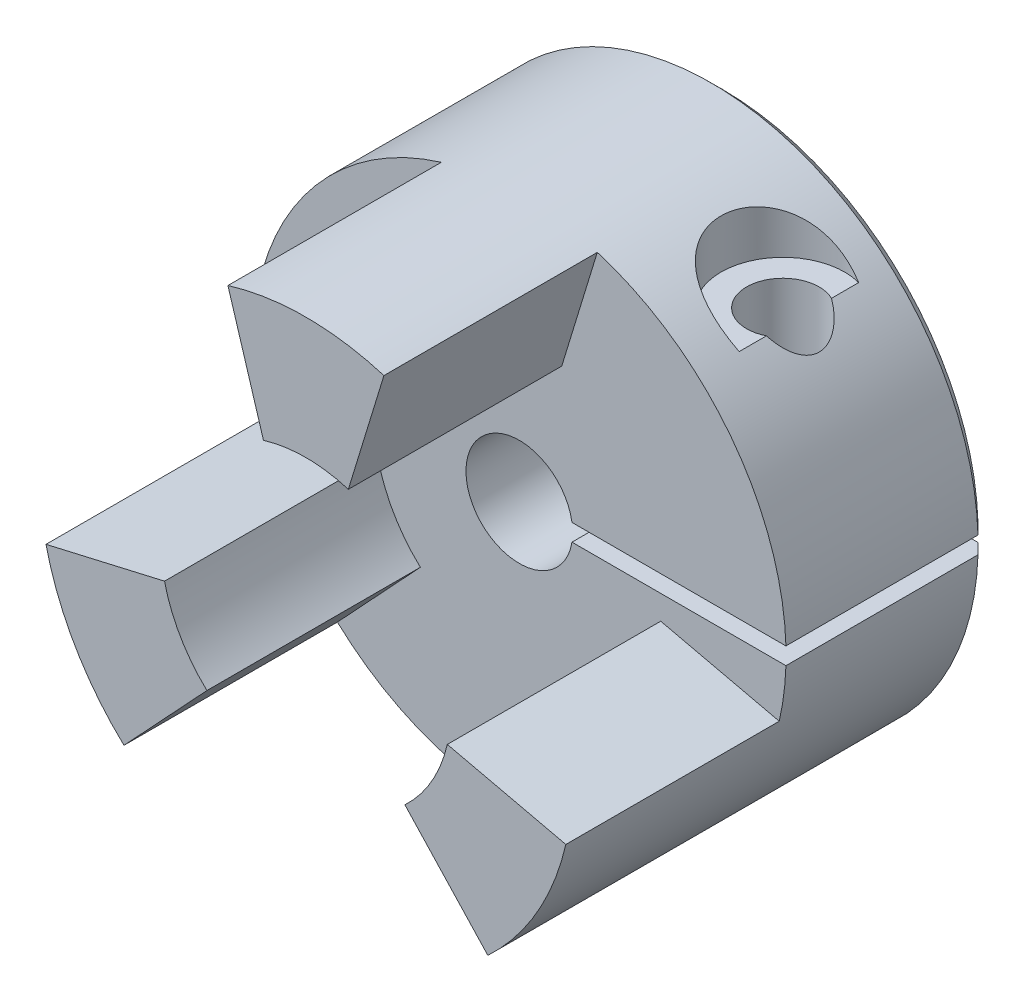
ISO-10303-21;
HEADER;
FILE_DESCRIPTION(('STEP AP214'),'2;1');
FILE_NAME('part.step','',(''),(''),'','','');
FILE_SCHEMA(('AUTOMOTIVE_DESIGN { 1 0 10303 214 1 1 1 1 }'));
ENDSEC;
DATA;
#1=APPLICATION_CONTEXT('core data for automotive mechanical design processes');
#2=APPLICATION_PROTOCOL_DEFINITION('international standard','automotive_design',2000,#1);
#3=PRODUCT_CONTEXT('',#1,'mechanical');
#4=PRODUCT('Part','Part','',(#3));
#5=PRODUCT_RELATED_PRODUCT_CATEGORY('part','',(#4));
#6=PRODUCT_DEFINITION_FORMATION('','',#4);
#7=PRODUCT_DEFINITION_CONTEXT('part definition',#1,'design');
#8=PRODUCT_DEFINITION('design','',#6,#7);
#9=PRODUCT_DEFINITION_SHAPE('','',#8);
#10=(LENGTH_UNIT() NAMED_UNIT(*) SI_UNIT(.MILLI.,.METRE.));
#11=(NAMED_UNIT(*) PLANE_ANGLE_UNIT() SI_UNIT($,.RADIAN.));
#12=(NAMED_UNIT(*) SI_UNIT($,.STERADIAN.) SOLID_ANGLE_UNIT());
#13=UNCERTAINTY_MEASURE_WITH_UNIT(LENGTH_MEASURE(1.E-05),#10,'distance_accuracy_value','');
#14=(GEOMETRIC_REPRESENTATION_CONTEXT(3) GLOBAL_UNCERTAINTY_ASSIGNED_CONTEXT((#13)) GLOBAL_UNIT_ASSIGNED_CONTEXT((#10,
#11,#12)) REPRESENTATION_CONTEXT('',''));
#15=CARTESIAN_POINT('',(0.,0.,0.));
#16=DIRECTION('',(0.,0.,1.));
#17=DIRECTION('',(1.,0.,0.));
#18=AXIS2_PLACEMENT_3D('',#15,#16,#17);
#19=CARTESIAN_POINT('',(-8.458759816138,-4.883667256857,19.5));
#20=DIRECTION('',(0.,0.,1.));
#21=DIRECTION('',(1.,0.,0.));
#22=AXIS2_PLACEMENT_3D('',#19,#20,#21);
#23=PLANE('',#22);
#24=DIRECTION('',(-0.974370064785194,-0.224951054344045,0.));
#25=VECTOR('',#24,1.);
#26=CARTESIAN_POINT('',(-6.62571644054,-1.529667169538,19.5));
#27=LINE('',#26,#25);
#28=CARTESIAN_POINT('',(-6.62571644054,-1.529667169538,19.5));
#29=VERTEX_POINT('',#28);
#30=CARTESIAN_POINT('',(-12.17962580981,-2.811888179298,19.5));
#31=VERTEX_POINT('',#30);
#32=EDGE_CURVE('E10',#29,#31,#27,.T.);
#33=ORIENTED_EDGE('',*,*,#32,.T.);
#34=CARTESIAN_POINT('',(0.,0.,19.5));
#35=DIRECTION('',(0.,0.,1.));
#36=DIRECTION('',(-0.974370064785194,-0.224951054344045,0.));
#37=AXIS2_PLACEMENT_3D('',#34,#35,#36);
#38=CIRCLE('',#37,12.5);
#39=CARTESIAN_POINT('',(-8.524979500781,-9.14192127024,19.5));
#40=VERTEX_POINT('',#39);
#41=EDGE_CURVE('E233',#31,#40,#38,.T.);
#42=ORIENTED_EDGE('',*,*,#41,.T.);
#43=DIRECTION('',(0.681998360062317,0.73135370161934,0.));
#44=VECTOR('',#43,1.);
#45=CARTESIAN_POINT('',(-8.524979500781,-9.14192127024,19.5));
#46=LINE('',#45,#44);
#47=CARTESIAN_POINT('',(-4.637588848425,-4.97320517101,19.5));
#48=VERTEX_POINT('',#47);
#49=EDGE_CURVE('E360',#40,#48,#46,.T.);
#50=ORIENTED_EDGE('',*,*,#49,.T.);
#51=CARTESIAN_POINT('',(0.,0.,19.5));
#52=DIRECTION('',(0.,0.,-1.));
#53=DIRECTION('',(-0.681998360062317,-0.73135370161934,0.));
#54=AXIS2_PLACEMENT_3D('',#51,#52,#53);
#55=CIRCLE('',#54,6.8);
#56=EDGE_CURVE('E30',#48,#29,#55,.T.);
#57=ORIENTED_EDGE('',*,*,#56,.T.);
#58=EDGE_LOOP('',(#33,#42,#50,#57));
#59=FACE_BOUND('',#58,.T.);
#60=ADVANCED_FACE('F16',(#59),#23,.T.);
#61=CARTESIAN_POINT('',(8.458759816138,-4.883667256857,19.5));
#62=DIRECTION('',(0.,0.,1.));
#63=DIRECTION('',(1.,0.,0.));
#64=AXIS2_PLACEMENT_3D('',#61,#62,#63);
#65=PLANE('',#64);
#66=DIRECTION('',(0.681998360062317,-0.73135370161934,0.));
#67=VECTOR('',#66,1.);
#68=CARTESIAN_POINT('',(4.637588848425,-4.97320517101,19.5));
#69=LINE('',#68,#67);
#70=CARTESIAN_POINT('',(4.637588848425,-4.97320517101,19.5));
#71=VERTEX_POINT('',#70);
#72=CARTESIAN_POINT('',(8.524979500781,-9.14192127024,19.5));
#73=VERTEX_POINT('',#72);
#74=EDGE_CURVE('E376',#71,#73,#69,.T.);
#75=ORIENTED_EDGE('',*,*,#74,.T.);
#76=CARTESIAN_POINT('',(0.,0.,19.5));
#77=DIRECTION('',(0.,0.,1.));
#78=DIRECTION('',(0.681998360062317,-0.73135370161934,0.));
#79=AXIS2_PLACEMENT_3D('',#76,#77,#78);
#80=CIRCLE('',#79,12.5);
#81=CARTESIAN_POINT('',(12.179625809815,-2.811888179298,19.5));
#82=VERTEX_POINT('',#81);
#83=EDGE_CURVE('E370',#73,#82,#80,.T.);
#84=ORIENTED_EDGE('',*,*,#83,.T.);
#85=DIRECTION('',(-0.974370064785194,0.224951054344045,0.));
#86=VECTOR('',#85,1.);
#87=CARTESIAN_POINT('',(12.179625809815,-2.811888179298,19.5));
#88=LINE('',#87,#86);
#89=CARTESIAN_POINT('',(6.62571644054,-1.529667169538,19.5));
#90=VERTEX_POINT('',#89);
#91=EDGE_CURVE('E335',#82,#90,#88,.T.);
#92=ORIENTED_EDGE('',*,*,#91,.T.);
#93=CARTESIAN_POINT('',(0.,0.,19.5));
#94=DIRECTION('',(0.,0.,-1.));
#95=DIRECTION('',(0.974370064785194,-0.224951054344045,0.));
#96=AXIS2_PLACEMENT_3D('',#93,#94,#95);
#97=CIRCLE('',#96,6.8);
#98=EDGE_CURVE('E374',#90,#71,#97,.T.);
#99=ORIENTED_EDGE('',*,*,#98,.T.);
#100=EDGE_LOOP('',(#75,#84,#92,#99));
#101=FACE_BOUND('',#100,.T.);
#102=ADVANCED_FACE('F666',(#101),#65,.T.);
#103=CARTESIAN_POINT('',(-6.62571644054,-1.529667169538,9.5));
#104=DIRECTION('',(0.224951054344045,-0.974370064785194,0.));
#105=DIRECTION('',(0.,0.,-1.));
#106=AXIS2_PLACEMENT_3D('',#103,#104,#105);
#107=PLANE('',#106);
#108=DIRECTION('',(-0.974370064785194,-0.224951054344045,0.));
#109=VECTOR('',#108,1.);
#110=CARTESIAN_POINT('',(-6.62571644054,-1.529667169538,9.5));
#111=LINE('',#110,#109);
#112=CARTESIAN_POINT('',(-6.62571644054,-1.529667169538,9.5));
#113=VERTEX_POINT('',#112);
#114=CARTESIAN_POINT('',(-12.17962580981,-2.811888179298,9.5));
#115=VERTEX_POINT('',#114);
#116=EDGE_CURVE('E316',#113,#115,#111,.T.);
#117=ORIENTED_EDGE('',*,*,#116,.T.);
#118=DIRECTION('',(0.,0.,1.));
#119=VECTOR('',#118,1.);
#120=CARTESIAN_POINT('',(-12.17962580981,-2.811888179298,9.5));
#121=LINE('',#120,#119);
#122=EDGE_CURVE('E239',#115,#31,#121,.T.);
#123=ORIENTED_EDGE('',*,*,#122,.T.);
#124=ORIENTED_EDGE('',*,*,#32,.F.);
#125=DIRECTION('',(0.,0.,1.));
#126=VECTOR('',#125,1.);
#127=CARTESIAN_POINT('',(-6.62571644054,-1.529667169538,9.5));
#128=LINE('',#127,#126);
#129=EDGE_CURVE('E328',#113,#29,#128,.T.);
#130=ORIENTED_EDGE('',*,*,#129,.F.);
#131=EDGE_LOOP('',(#117,#123,#124,#130));
#132=FACE_BOUND('',#131,.T.);
#133=ADVANCED_FACE('F659',(#132),#107,.F.);
#134=CARTESIAN_POINT('',(0.,0.,9.5));
#135=DIRECTION('',(0.,0.,-1.));
#136=DIRECTION('',(-0.681998360062317,-0.73135370161934,0.));
#137=AXIS2_PLACEMENT_3D('',#134,#135,#136);
#138=CYLINDRICAL_SURFACE('',#137,6.8);
#139=CARTESIAN_POINT('',(0.,0.,9.5));
#140=DIRECTION('',(0.,0.,-1.));
#141=DIRECTION('',(-0.681998360062317,-0.73135370161934,0.));
#142=AXIS2_PLACEMENT_3D('',#139,#140,#141);
#143=CIRCLE('',#142,6.8);
#144=CARTESIAN_POINT('',(-4.637588848425,-4.97320517101,9.5));
#145=VERTEX_POINT('',#144);
#146=EDGE_CURVE('E322',#145,#113,#143,.T.);
#147=ORIENTED_EDGE('',*,*,#146,.T.);
#148=ORIENTED_EDGE('',*,*,#129,.T.);
#149=ORIENTED_EDGE('',*,*,#56,.F.);
#150=DIRECTION('',(0.,0.,1.));
#151=VECTOR('',#150,1.);
#152=CARTESIAN_POINT('',(-4.637588848425,-4.97320517101,9.5));
#153=LINE('',#152,#151);
#154=EDGE_CURVE('E403',#145,#48,#153,.T.);
#155=ORIENTED_EDGE('',*,*,#154,.F.);
#156=EDGE_LOOP('',(#147,#148,#149,#155));
#157=FACE_BOUND('',#156,.T.);
#158=ADVANCED_FACE('F647',(#157),#138,.F.);
#159=CARTESIAN_POINT('',(-8.524979500781,-9.14192127024,9.5));
#160=DIRECTION('',(-0.73135370161934,0.681998360062317,0.));
#161=DIRECTION('',(0.,0.,1.));
#162=AXIS2_PLACEMENT_3D('',#159,#160,#161);
#163=PLANE('',#162);
#164=DIRECTION('',(0.681998360062317,0.73135370161934,0.));
#165=VECTOR('',#164,1.);
#166=CARTESIAN_POINT('',(-8.524979500781,-9.14192127024,9.5));
#167=LINE('',#166,#165);
#168=CARTESIAN_POINT('',(-8.524979500781,-9.14192127024,9.5));
#169=VERTEX_POINT('',#168);
#170=EDGE_CURVE('E310',#169,#145,#167,.T.);
#171=ORIENTED_EDGE('',*,*,#170,.T.);
#172=ORIENTED_EDGE('',*,*,#154,.T.);
#173=ORIENTED_EDGE('',*,*,#49,.F.);
#174=DIRECTION('',(0.,0.,1.));
#175=VECTOR('',#174,1.);
#176=CARTESIAN_POINT('',(-8.524979500781,-9.14192127024,9.5));
#177=LINE('',#176,#175);
#178=EDGE_CURVE('E236',#169,#40,#177,.T.);
#179=ORIENTED_EDGE('',*,*,#178,.F.);
#180=EDGE_LOOP('',(#171,#172,#173,#179));
#181=FACE_BOUND('',#180,.T.);
#182=ADVANCED_FACE('F637',(#181),#163,.F.);
#183=CARTESIAN_POINT('',(4.637588848425,-4.97320517101,9.5));
#184=DIRECTION('',(0.73135370161934,0.681998360062317,0.));
#185=DIRECTION('',(0.,0.,-1.));
#186=AXIS2_PLACEMENT_3D('',#183,#184,#185);
#187=PLANE('',#186);
#188=DIRECTION('',(0.681998360062317,-0.73135370161934,0.));
#189=VECTOR('',#188,1.);
#190=CARTESIAN_POINT('',(4.637588848425,-4.97320517101,9.5));
#191=LINE('',#190,#189);
#192=CARTESIAN_POINT('',(4.637588848425,-4.97320517101,9.5));
#193=VERTEX_POINT('',#192);
#194=CARTESIAN_POINT('',(8.524979500781,-9.14192127024,9.5));
#195=VERTEX_POINT('',#194);
#196=EDGE_CURVE('E304',#193,#195,#191,.T.);
#197=ORIENTED_EDGE('',*,*,#196,.T.);
#198=DIRECTION('',(0.,0.,1.));
#199=VECTOR('',#198,1.);
#200=CARTESIAN_POINT('',(8.524979500781,-9.14192127024,9.5));
#201=LINE('',#200,#199);
#202=EDGE_CURVE('E375',#195,#73,#201,.T.);
#203=ORIENTED_EDGE('',*,*,#202,.T.);
#204=ORIENTED_EDGE('',*,*,#74,.F.);
#205=DIRECTION('',(0.,0.,1.));
#206=VECTOR('',#205,1.);
#207=CARTESIAN_POINT('',(4.637588848425,-4.97320517101,9.5));
#208=LINE('',#207,#206);
#209=EDGE_CURVE('E378',#193,#71,#208,.T.);
#210=ORIENTED_EDGE('',*,*,#209,.F.);
#211=EDGE_LOOP('',(#197,#203,#204,#210));
#212=FACE_BOUND('',#211,.T.);
#213=ADVANCED_FACE('F633',(#212),#187,.F.);
#214=CARTESIAN_POINT('',(0.,0.,9.5));
#215=DIRECTION('',(0.,0.,-1.));
#216=DIRECTION('',(0.974370064785194,-0.224951054344045,0.));
#217=AXIS2_PLACEMENT_3D('',#214,#215,#216);
#218=CYLINDRICAL_SURFACE('',#217,6.8);
#219=CARTESIAN_POINT('',(0.,0.,9.5));
#220=DIRECTION('',(0.,0.,-1.));
#221=DIRECTION('',(0.974370064785194,-0.224951054344045,0.));
#222=AXIS2_PLACEMENT_3D('',#219,#220,#221);
#223=CIRCLE('',#222,6.8);
#224=CARTESIAN_POINT('',(6.62571644054,-1.529667169538,9.5));
#225=VERTEX_POINT('',#224);
#226=EDGE_CURVE('E306',#225,#193,#223,.T.);
#227=ORIENTED_EDGE('',*,*,#226,.T.);
#228=ORIENTED_EDGE('',*,*,#209,.T.);
#229=ORIENTED_EDGE('',*,*,#98,.F.);
#230=DIRECTION('',(0.,0.,1.));
#231=VECTOR('',#230,1.);
#232=CARTESIAN_POINT('',(6.62571644054,-1.529667169538,9.5));
#233=LINE('',#232,#231);
#234=EDGE_CURVE('E326',#225,#90,#233,.T.);
#235=ORIENTED_EDGE('',*,*,#234,.F.);
#236=EDGE_LOOP('',(#227,#228,#229,#235));
#237=FACE_BOUND('',#236,.T.);
#238=ADVANCED_FACE('F625',(#237),#218,.F.);
#239=CARTESIAN_POINT('',(12.179625809815,-2.811888179298,9.5));
#240=DIRECTION('',(-0.224951054344045,-0.974370064785194,0.));
#241=DIRECTION('',(-0.974370064785194,0.224951054344045,0.));
#242=AXIS2_PLACEMENT_3D('',#239,#240,#241);
#243=PLANE('',#242);
#244=DIRECTION('',(-0.974370064785194,0.224951054344045,0.));
#245=VECTOR('',#244,1.);
#246=CARTESIAN_POINT('',(12.179625809815,-2.811888179298,9.5));
#247=LINE('',#246,#245);
#248=CARTESIAN_POINT('',(12.179625809815,-2.811888179298,9.5));
#249=VERTEX_POINT('',#248);
#250=EDGE_CURVE('E211',#249,#225,#247,.T.);
#251=ORIENTED_EDGE('',*,*,#250,.T.);
#252=ORIENTED_EDGE('',*,*,#234,.T.);
#253=ORIENTED_EDGE('',*,*,#91,.F.);
#254=DIRECTION('',(0.,0.,1.));
#255=VECTOR('',#254,1.);
#256=CARTESIAN_POINT('',(12.179625809815,-2.811888179298,9.5));
#257=LINE('',#256,#255);
#258=EDGE_CURVE('E363',#249,#82,#257,.T.);
#259=ORIENTED_EDGE('',*,*,#258,.F.);
#260=EDGE_LOOP('',(#251,#252,#253,#259));
#261=FACE_BOUND('',#260,.T.);
#262=ADVANCED_FACE('F613',(#261),#243,.F.);
#263=CARTESIAN_POINT('',(0.,0.,9.5));
#264=DIRECTION('',(0.,0.,-1.));
#265=DIRECTION('',(-0.292371704722988,0.956304755962959,0.));
#266=AXIS2_PLACEMENT_3D('',#263,#264,#265);
#267=CYLINDRICAL_SURFACE('',#266,6.8);
#268=CARTESIAN_POINT('',(0.,0.,9.5));
#269=DIRECTION('',(0.,0.,-1.));
#270=DIRECTION('',(-0.292371704722988,0.956304755962959,0.));
#271=AXIS2_PLACEMENT_3D('',#268,#269,#270);
#272=CIRCLE('',#271,6.8);
#273=CARTESIAN_POINT('',(-1.988127592115,6.502872340549,9.5));
#274=VERTEX_POINT('',#273);
#275=CARTESIAN_POINT('',(1.988127592115,6.502872340549,9.5));
#276=VERTEX_POINT('',#275);
#277=EDGE_CURVE('E349',#274,#276,#272,.T.);
#278=ORIENTED_EDGE('',*,*,#277,.T.);
#279=DIRECTION('',(0.,0.,1.));
#280=VECTOR('',#279,1.);
#281=CARTESIAN_POINT('',(1.988127592115,6.502872340549,9.5));
#282=LINE('',#281,#280);
#283=CARTESIAN_POINT('',(1.988127592115,6.502872340549,19.5));
#284=VERTEX_POINT('',#283);
#285=EDGE_CURVE('E358',#276,#284,#282,.T.);
#286=ORIENTED_EDGE('',*,*,#285,.T.);
#287=CARTESIAN_POINT('',(0.,0.,19.5));
#288=DIRECTION('',(0.,0.,-1.));
#289=DIRECTION('',(-0.292371704722988,0.956304755962959,0.));
#290=AXIS2_PLACEMENT_3D('',#287,#288,#289);
#291=CIRCLE('',#290,6.8);
#292=CARTESIAN_POINT('',(-1.988127592115,6.502872340549,19.5));
#293=VERTEX_POINT('',#292);
#294=EDGE_CURVE('E252',#293,#284,#291,.T.);
#295=ORIENTED_EDGE('',*,*,#294,.F.);
#296=DIRECTION('',(0.,0.,1.));
#297=VECTOR('',#296,1.);
#298=CARTESIAN_POINT('',(-1.988127592115,6.502872340549,9.5));
#299=LINE('',#298,#297);
#300=EDGE_CURVE('E255',#274,#293,#299,.T.);
#301=ORIENTED_EDGE('',*,*,#300,.F.);
#302=EDGE_LOOP('',(#278,#286,#295,#301));
#303=FACE_BOUND('',#302,.T.);
#304=ADVANCED_FACE('F603',(#303),#267,.F.);
#305=CARTESIAN_POINT('',(0.,0.,-1.));
#306=DIRECTION('',(0.,0.,-1.));
#307=DIRECTION('',(1.,0.,0.));
#308=AXIS2_PLACEMENT_3D('',#305,#306,#307);
#309=CYLINDRICAL_SURFACE('',#308,2.5);
#310=DIRECTION('',(0.,0.,-1.));
#311=VECTOR('',#310,1.);
#312=CARTESIAN_POINT('',(2.467792535851,-0.4,-1.));
#313=LINE('',#312,#311);
#314=CARTESIAN_POINT('',(2.467792535851,-0.4,9.5));
#315=VERTEX_POINT('',#314);
#316=CARTESIAN_POINT('',(2.467792535851,-0.4,0.));
#317=VERTEX_POINT('',#316);
#318=EDGE_CURVE('E201',#315,#317,#313,.T.);
#319=ORIENTED_EDGE('',*,*,#318,.T.);
#320=CARTESIAN_POINT('',(0.,0.,0.));
#321=DIRECTION('',(0.,0.,-1.));
#322=DIRECTION('',(1.,0.,0.));
#323=AXIS2_PLACEMENT_3D('',#320,#321,#322);
#324=CIRCLE('',#323,2.5);
#325=CARTESIAN_POINT('',(2.467792535851,0.4,0.));
#326=VERTEX_POINT('',#325);
#327=EDGE_CURVE('E334',#317,#326,#324,.T.);
#328=ORIENTED_EDGE('',*,*,#327,.T.);
#329=DIRECTION('',(0.,0.,-1.));
#330=VECTOR('',#329,1.);
#331=CARTESIAN_POINT('',(2.467792535851,0.4,-1.));
#332=LINE('',#331,#330);
#333=CARTESIAN_POINT('',(2.467792535851,0.4,9.5));
#334=VERTEX_POINT('',#333);
#335=EDGE_CURVE('E295',#334,#326,#332,.T.);
#336=ORIENTED_EDGE('',*,*,#335,.F.);
#337=CARTESIAN_POINT('',(0.,0.,9.5));
#338=DIRECTION('',(0.,0.,-1.));
#339=DIRECTION('',(1.,0.,0.));
#340=AXIS2_PLACEMENT_3D('',#337,#338,#339);
#341=CIRCLE('',#340,2.5);
#342=EDGE_CURVE('E342',#315,#334,#341,.T.);
#343=ORIENTED_EDGE('',*,*,#342,.F.);
#344=EDGE_LOOP('',(#319,#328,#336,#343));
#345=FACE_BOUND('',#344,.T.);
#346=ADVANCED_FACE('F594',(#345),#309,.F.);
#347=CARTESIAN_POINT('',(0.,0.,0.));
#348=DIRECTION('',(0.,0.,1.));
#349=DIRECTION('',(1.,0.,0.));
#350=AXIS2_PLACEMENT_3D('',#347,#348,#349);
#351=PLANE('',#350);
#352=ORIENTED_EDGE('',*,*,#327,.F.);
#353=DIRECTION('',(-1.,0.,0.));
#354=VECTOR('',#353,1.);
#355=CARTESIAN_POINT('',(0.,-0.4,0.));
#356=LINE('',#355,#354);
#357=CARTESIAN_POINT('',(11.993331480452,-0.4,0.));
#358=VERTEX_POINT('',#357);
#359=EDGE_CURVE('E203',#358,#317,#356,.T.);
#360=ORIENTED_EDGE('',*,*,#359,.F.);
#361=CARTESIAN_POINT('',(0.,0.,0.));
#362=DIRECTION('',(0.,0.,1.));
#363=DIRECTION('',(1.,0.,0.));
#364=AXIS2_PLACEMENT_3D('',#361,#362,#363);
#365=CIRCLE('',#364,12.);
#366=CARTESIAN_POINT('',(11.993331480452,0.4,0.));
#367=VERTEX_POINT('',#366);
#368=EDGE_CURVE('E283',#367,#358,#365,.T.);
#369=ORIENTED_EDGE('',*,*,#368,.F.);
#370=DIRECTION('',(1.,0.,0.));
#371=VECTOR('',#370,1.);
#372=CARTESIAN_POINT('',(7.75,0.4,0.));
#373=LINE('',#372,#371);
#374=EDGE_CURVE('E300',#326,#367,#373,.T.);
#375=ORIENTED_EDGE('',*,*,#374,.F.);
#376=EDGE_LOOP('',(#352,#360,#369,#375));
#377=FACE_BOUND('',#376,.T.);
#378=ADVANCED_FACE('F534',(#377),#351,.F.);
#379=CARTESIAN_POINT('',(7.6,0.,4.75));
#380=DIRECTION('',(0.,1.,0.));
#381=DIRECTION('',(1.,0.,0.));
#382=AXIS2_PLACEMENT_3D('',#379,#380,#381);
#383=CYLINDRICAL_SURFACE('',#382,1.25);
#384=CARTESIAN_POINT('',(8.85,-8.827655407865,4.75));
#385=CARTESIAN_POINT('',(8.85,-8.827655407865,4.853307019575));
#386=CARTESIAN_POINT('',(8.839754654033,-8.837926566302,4.95630153231));
#387=CARTESIAN_POINT('',(8.819379535591,-8.858353830362,5.057532010143));
#388=CARTESIAN_POINT('',(8.789322078066,-8.888307127102,5.15556079008));
#389=CARTESIAN_POINT('',(8.750366294544,-8.926662822533,5.249022574139));
#390=CARTESIAN_POINT('',(8.686105997512,-8.989002526655,5.369907783956));
#391=CARTESIAN_POINT('',(8.667345592766,-9.007121583819,5.402311963592));
#392=CARTESIAN_POINT('',(8.647504432917,-9.026189493753,5.433906443106));
#393=CARTESIAN_POINT('',(8.626625784702,-9.046145619286,5.464657614295));
#394=CARTESIAN_POINT('',(8.604753718599,-9.066928838878,5.494533411073));
#395=CARTESIAN_POINT('',(8.528935665659,-9.13852118814,5.590781553153));
#396=CARTESIAN_POINT('',(8.470836836656,-9.19268061273,5.653156939576));
#397=CARTESIAN_POINT('',(8.40810919919,-9.250272574941,5.710372417119));
#398=CARTESIAN_POINT('',(8.341193333653,-9.31066428128,5.762174129366));
#399=CARTESIAN_POINT('',(8.270510919508,-9.373273930392,5.808306186673));
#400=CARTESIAN_POINT('',(8.131870467456,-9.493682387322,5.883586611635));
#401=CARTESIAN_POINT('',(8.064681105835,-9.551104934369,5.914165721682));
#402=CARTESIAN_POINT('',(7.995200704712,-9.609471387246,5.940047912392));
#403=CARTESIAN_POINT('',(7.92373158723,-9.668431680536,5.961036376931));
#404=CARTESIAN_POINT('',(7.850592978043,-9.727653155893,5.976931428569));
#405=CARTESIAN_POINT('',(7.706155977538,-9.842415696989,5.997487857852));
#406=CARTESIAN_POINT('',(7.63499336893,-9.897978812132,6.002772131268));
#407=CARTESIAN_POINT('',(7.563027772369,-9.953162808524,6.00319346473));
#408=CARTESIAN_POINT('',(7.490669530985,-10.00764184214,5.998605542379));
#409=CARTESIAN_POINT('',(7.418349101142,-10.06111223989,5.988904458068));
#410=CARTESIAN_POINT('',(7.27247861544,-10.16707572696,5.958696132704));
#411=CARTESIAN_POINT('',(7.198967119188,-10.21948259978,5.937868011719));
#412=CARTESIAN_POINT('',(7.126610379039,-10.27010664646,5.911508875691));
#413=CARTESIAN_POINT('',(7.056032304057,-10.31859895195,5.879693210523));
#414=CARTESIAN_POINT('',(6.987835833403,-10.36466551158,5.842603629749));
#415=CARTESIAN_POINT('',(6.86717781032,-10.44491729488,5.764799695505));
#416=CARTESIAN_POINT('',(6.813920094666,-10.47982936903,5.725492156921));
#417=CARTESIAN_POINT('',(6.76315456801,-10.51265575987,5.682789862927));
#418=CARTESIAN_POINT('',(6.715194998492,-10.54328280843,5.636926385801));
#419=CARTESIAN_POINT('',(6.670319739995,-10.57162414998,5.588184002216));
#420=CARTESIAN_POINT('',(6.585954074167,-10.62439450322,5.484054043984));
#421=CARTESIAN_POINT('',(6.546668936977,-10.64867843835,5.42851320679));
#422=CARTESIAN_POINT('',(6.511115607863,-10.6704320075,5.370572638154));
#423=CARTESIAN_POINT('',(6.479468537593,-10.68963240033,5.310557900705));
#424=CARTESIAN_POINT('',(6.451864161102,-10.70626908047,5.248815542774));
#425=CARTESIAN_POINT('',(6.402431630796,-10.7359110365,5.115894276277));
#426=CARTESIAN_POINT('',(6.381524404887,-10.74834529361,5.044394266536));
#427=CARTESIAN_POINT('',(6.365777011547,-10.75765869578,4.971630533408));
#428=CARTESIAN_POINT('',(6.355257847497,-10.763862402,4.898025736729));
#429=CARTESIAN_POINT('',(6.35,-10.7669633602,4.824005888656));
#430=CARTESIAN_POINT('',(6.35,-10.7669633602,4.675749404153));
#431=CARTESIAN_POINT('',(6.355292676913,-10.76384185962,4.601484617501));
#432=CARTESIAN_POINT('',(6.365881568209,-10.75759703377,4.527639022595));
#433=CARTESIAN_POINT('',(6.38173312822,-10.74822184924,4.454642947592));
#434=CARTESIAN_POINT('',(6.402778002095,-10.73570503043,4.38292330264));
#435=CARTESIAN_POINT('',(6.45229898921,-10.7060067905,4.250244634961));
#436=CARTESIAN_POINT('',(6.479765880514,-10.68945132874,4.188934663098));
#437=CARTESIAN_POINT('',(6.511220640956,-10.67036627647,4.129331925938));
#438=CARTESIAN_POINT('',(6.546529403191,-10.64876201468,4.071776045878));
#439=CARTESIAN_POINT('',(6.585521279798,-10.62466088039,4.016586203801));
#440=CARTESIAN_POINT('',(6.668981868836,-10.57246508848,3.913366802775));
#441=CARTESIAN_POINT('',(6.7132097918,-10.54454054131,3.86515717846));
#442=CARTESIAN_POINT('',(6.760451486899,-10.51438530626,3.819747872367));
#443=CARTESIAN_POINT('',(6.810440043671,-10.48208185321,3.777411366568));
#444=CARTESIAN_POINT('',(6.86287478497,-10.447738495,3.738374042431));
#445=CARTESIAN_POINT('',(6.983339572459,-10.36770129974,3.659853330061));
#446=CARTESIAN_POINT('',(7.052307511998,-10.32115718917,3.621992444006));
#447=CARTESIAN_POINT('',(7.123745681613,-10.27211041314,3.589537746413));
#448=CARTESIAN_POINT('',(7.197027078398,-10.22086551621,3.562682574414));
#449=CARTESIAN_POINT('',(7.271502153439,-10.16778505016,3.541506082856));
#450=CARTESIAN_POINT('',(7.418349101142,-10.06111223989,3.511095541932));
#451=CARTESIAN_POINT('',(7.490669530986,-10.00764184214,3.501394457621));
#452=CARTESIAN_POINT('',(7.563027772369,-9.953162808525,3.49680653527));
#453=CARTESIAN_POINT('',(7.63499336893,-9.897978812132,3.497227868732));
#454=CARTESIAN_POINT('',(7.706155977538,-9.842415696989,3.502512142148));
#455=CARTESIAN_POINT('',(7.850663768786,-9.727596909048,3.523078646446));
#456=CARTESIAN_POINT('',(7.923870876602,-9.668318897507,3.538993884148));
#457=CARTESIAN_POINT('',(7.995405067209,-9.609302793269,3.560012101388));
#458=CARTESIAN_POINT('',(8.064946063899,-9.55088235275,3.585933010895));
#459=CARTESIAN_POINT('',(8.132190590559,-9.493408784848,3.616559160783));
#460=CARTESIAN_POINT('',(8.270653718504,-9.373144834585,3.691803545057));
#461=CARTESIAN_POINT('',(8.341127350451,-9.31071900189,3.737809833737));
#462=CARTESIAN_POINT('',(8.40785565361,-9.250498948334,3.789452939953));
#463=CARTESIAN_POINT('',(8.470420767593,-9.193061248836,3.846479265625));
#464=CARTESIAN_POINT('',(8.528386125389,-9.139032904755,3.908637367058));
#465=CARTESIAN_POINT('',(8.60430884344,-9.067351987908,4.004852129921));
#466=CARTESIAN_POINT('',(8.626371279795,-9.046389668858,4.03495246502));
#467=CARTESIAN_POINT('',(8.647424860321,-9.02626702682,4.065942535511));
#468=CARTESIAN_POINT('',(8.667424452673,-9.00704665318,4.097789516536));
#469=CARTESIAN_POINT('',(8.686325753014,-8.988790641035,4.130458991875));
#470=CARTESIAN_POINT('',(8.750603644092,-8.926429110883,4.251547687505));
#471=CARTESIAN_POINT('',(8.789468550592,-8.888161169262,4.34491725712));
#472=CARTESIAN_POINT('',(8.819454187832,-8.85827898526,4.442838548581));
#473=CARTESIAN_POINT('',(8.839779813293,-8.837901344432,4.543950465094));
#474=CARTESIAN_POINT('',(8.85,-8.827655407865,4.646819906236));
#475=CARTESIAN_POINT('',(8.85,-8.827655407865,4.75));
#476=B_SPLINE_CURVE_WITH_KNOTS('',6,(#384,#385,#386,#387,#388,#389,#390,#391,#392,#393,#394,
#395,#396,#397,#398,#399,#400,#401,#402,#403,#404,#405,#406,#407,#408,#409,#410,#411,#412,#413,
#414,#415,#416,#417,#418,#419,#420,#421,#422,#423,#424,#425,#426,#427,#428,#429,#430,#431,#432,
#433,#434,#435,#436,#437,#438,#439,#440,#441,#442,#443,#444,#445,#446,#447,#448,#449,#450,#451,
#452,#453,#454,#455,#456,#457,#458,#459,#460,#461,#462,#463,#464,#465,#466,#467,#468,#469,#470,
#471,#472,#473,#474,#475),.UNSPECIFIED.,.T.,.F.,(7,5,5,5,5,5,5,5,5,5,5,5,5,5,5,5,5,5,7),(0.,
0.0770996874463,0.106265943554,0.174000198536,0.233110682332,0.28865239882,0.345898291224,
0.39451147005,0.444589982347,0.499996165841,0.555585554912,0.605330598572,0.653339132276,
0.711340944586,0.766883538056,0.826051148836,0.893592570985,0.922992201482,1.),.UNSPECIFIED.);
#477=CARTESIAN_POINT('',(8.85,-8.827655407865,4.75));
#478=VERTEX_POINT('',#477);
#479=EDGE_CURVE('E288',#478,#478,#476,.T.);
#480=ORIENTED_EDGE('',*,*,#479,.T.);
#481=EDGE_LOOP('',(#480));
#482=FACE_BOUND('',#481,.T.);
#483=CARTESIAN_POINT('',(7.6,-0.4,4.75));
#484=DIRECTION('',(0.,1.,0.));
#485=DIRECTION('',(1.,0.,0.));
#486=AXIS2_PLACEMENT_3D('',#483,#484,#485);
#487=CIRCLE('',#486,1.25);
#488=CARTESIAN_POINT('',(8.85,-0.4,4.75));
#489=VERTEX_POINT('',#488);
#490=EDGE_CURVE('E315',#489,#489,#487,.T.);
#491=ORIENTED_EDGE('',*,*,#490,.T.);
#492=EDGE_LOOP('',(#491));
#493=FACE_BOUND('',#492,.T.);
#494=ADVANCED_FACE('F529',(#482,#493),#383,.F.);
#495=CARTESIAN_POINT('',(7.6,13.5,4.75));
#496=DIRECTION('',(0.,1.,0.));
#497=DIRECTION('',(1.,0.,0.));
#498=AXIS2_PLACEMENT_3D('',#495,#496,#497);
#499=CYLINDRICAL_SURFACE('',#498,2.9);
#500=CARTESIAN_POINT('',(8.352245875212,9.2999994,7.550736714371));
#501=CARTESIAN_POINT('',(8.189790673846,9.445898956242,7.594370324952));
#502=CARTESIAN_POINT('',(8.020669083751,9.591377068562,7.627166048925));
#503=CARTESIAN_POINT('',(7.845477753323,9.735349239203,7.647873114899));
#504=CARTESIAN_POINT('',(7.665033670477,9.876757044954,7.655149454433));
#505=CARTESIAN_POINT('',(7.396898997678,10.077041497532,7.64408802958));
#506=CARTESIAN_POINT('',(7.312523579812,10.138708060293,7.637589386787));
#507=CARTESIAN_POINT('',(7.227524888648,10.199472062363,7.627912610315));
#508=CARTESIAN_POINT('',(7.142096814586,10.259201780294,7.614948224714));
#509=CARTESIAN_POINT('',(6.889269808422,10.432112931649,7.566705010826));
#510=CARTESIAN_POINT('',(6.721069483333,10.542178147855,7.521899483058));
#511=CARTESIAN_POINT('',(6.554033971059,10.64662735261,7.463584265437));
#512=CARTESIAN_POINT('',(6.39038990561,10.744589925156,7.391783579455));
#513=CARTESIAN_POINT('',(6.075679009089,10.925599953677,7.223450948068));
#514=CARTESIAN_POINT('',(5.924761116884,11.008640488724,7.127322720311));
#515=CARTESIAN_POINT('',(5.781392621497,11.084273012867,7.019520237318));
#516=CARTESIAN_POINT('',(5.647301717246,11.152441146517,6.901341812749));
#517=CARTESIAN_POINT('',(5.454630449608,11.247352959501,6.703765409737));
#518=CARTESIAN_POINT('',(5.388754420938,11.279141444538,6.630156126049));
#519=CARTESIAN_POINT('',(5.326300857233,11.308718113356,6.554085575219));
#520=CARTESIAN_POINT('',(5.267391636778,11.336149393192,6.475811459058));
#521=CARTESIAN_POINT('',(5.150818050762,11.389627842348,6.306656275912));
#522=CARTESIAN_POINT('',(5.093988104457,11.415198152903,6.215327510598));
#523=CARTESIAN_POINT('',(5.041705538862,11.438334445922,6.121923261949));
#524=CARTESIAN_POINT('',(4.994020981035,11.459142792894,6.026742153926));
#525=CARTESIAN_POINT('',(4.921730562443,11.490325569947,5.864465300761));
#526=CARTESIAN_POINT('',(4.894627188704,11.501906360648,5.798157761832));
#527=CARTESIAN_POINT('',(4.86965578254,11.512489871564,5.731242834144));
#528=CARTESIAN_POINT('',(4.846817429559,11.522103311555,5.663797370894));
#529=CARTESIAN_POINT('',(4.775847809817,11.551807067416,5.431070430391));
#530=CARTESIAN_POINT('',(4.738151928271,11.567262654695,5.263580143289));
#531=CARTESIAN_POINT('',(4.712965780166,11.577484693735,5.094361167602));
#532=CARTESIAN_POINT('',(4.700251722349,11.582643645496,4.924300323142));
#533=CARTESIAN_POINT('',(4.699651748248,11.58288710076,4.513912356601));
#534=CARTESIAN_POINT('',(4.724196104025,11.572928290969,4.273452151516));
#535=CARTESIAN_POINT('',(4.773676823198,11.552851326642,4.035341011815));
#536=CARTESIAN_POINT('',(4.848227829546,11.521999489301,3.80212150085));
#537=CARTESIAN_POINT('',(4.991765456916,11.460129018157,3.477656644534));
#538=CARTESIAN_POINT('',(5.040464974438,11.43888944668,3.380085764369));
#539=CARTESIAN_POINT('',(5.093991217165,11.415208877701,3.284374368496));
#540=CARTESIAN_POINT('',(5.152289870468,11.388973316919,3.190843392717));
#541=CARTESIAN_POINT('',(5.270164479756,11.334858333901,3.020500263491));
#542=CARTESIAN_POINT('',(5.328612194289,11.307624598795,2.943083435187));
#543=CARTESIAN_POINT('',(5.390531353384,11.278286291831,2.867832417893));
#544=CARTESIAN_POINT('',(5.455803030046,11.246779132179,2.794997448488));
#545=CARTESIAN_POINT('',(5.648945004824,11.151624693558,2.597036610898));
#546=CARTESIAN_POINT('',(5.784367158358,11.082753866231,2.477905659488));
#547=CARTESIAN_POINT('',(5.929219322184,11.006282175212,2.369358935164));
#548=CARTESIAN_POINT('',(6.081718964817,10.922271277728,2.272725276877));
#549=CARTESIAN_POINT('',(6.346718998429,10.769603624014,2.13200049533));
#550=CARTESIAN_POINT('',(6.456059601248,10.7048573893,2.081078977151));
#551=CARTESIAN_POINT('',(6.567238100909,10.63708349582,2.036200140921));
#552=CARTESIAN_POINT('',(6.679557117818,10.56653003314,1.997443450152));
#553=CARTESIAN_POINT('',(6.931387029225,10.403524389833,1.924415949046));
#554=CARTESIAN_POINT('',(7.071045825746,10.309856116469,1.893327254063));
#555=CARTESIAN_POINT('',(7.210297799199,10.212986176042,1.871243129875));
#556=CARTESIAN_POINT('',(7.348200550003,10.113488114805,1.85776304664));
#557=CARTESIAN_POINT('',(7.667702679901,9.874664976334,1.844959098613));
#558=CARTESIAN_POINT('',(7.847421635645,9.733751471134,1.85235721208));
#559=CARTESIAN_POINT('',(8.021919389798,9.590301403246,1.873076714456));
#560=CARTESIAN_POINT('',(8.190390330972,9.445360409568,1.905790736099));
#561=CARTESIAN_POINT('',(8.352245875212,9.2999994,1.949263285629));
#562=B_SPLINE_CURVE_WITH_KNOTS('',5,(#500,#501,#502,#503,#504,#505,#506,#507,#508,#509,#510,
#511,#512,#513,#514,#515,#516,#517,#518,#519,#520,#521,#522,#523,#524,#525,#526,#527,#528,#529,
#530,#531,#532,#533,#534,#535,#536,#537,#538,#539,#540,#541,#542,#543,#544,#545,#546,#547,#548,
#549,#550,#551,#552,#553,#554,#555,#556,#557,#558,#559,#560,#561),.UNSPECIFIED.,.F.,.F.,(6,4,4,
4,4,4,4,4,4,4,4,4,4,4,4,6),(0.,0.0907361888088,0.131819862249,0.212004502914,0.291358770462,
0.335782265815,0.385054550036,0.418503074707,0.499690639611,0.614423797645,0.66488261846,
0.708847254491,0.788883189908,0.842951774085,0.909642050167,1.),.UNSPECIFIED.);
#563=CARTESIAN_POINT('',(8.352245207128,9.3,7.550736893811));
#564=VERTEX_POINT('',#563);
#565=CARTESIAN_POINT('',(8.352245207128,9.3,1.949263106189));
#566=VERTEX_POINT('',#565);
#567=EDGE_CURVE('E19',#564,#566,#562,.T.);
#568=ORIENTED_EDGE('',*,*,#567,.F.);
#569=CARTESIAN_POINT('',(7.6,9.3,4.75));
#570=DIRECTION('',(0.,-1.,0.));
#571=DIRECTION('',(1.,0.,0.));
#572=AXIS2_PLACEMENT_3D('',#569,#570,#571);
#573=CIRCLE('',#572,2.9);
#574=EDGE_CURVE('E386',#564,#566,#573,.T.);
#575=ORIENTED_EDGE('',*,*,#574,.T.);
#576=EDGE_LOOP('',(#568,#575));
#577=FACE_BOUND('',#576,.T.);
#578=ADVANCED_FACE('F441',(#577),#499,.F.);
#579=CARTESIAN_POINT('',(7.6,9.3,4.75));
#580=DIRECTION('',(0.,-1.,0.));
#581=DIRECTION('',(0.,0.,-1.));
#582=AXIS2_PLACEMENT_3D('',#579,#580,#581);
#583=PLANE('',#582);
#584=CARTESIAN_POINT('',(7.6,9.3,4.75));
#585=DIRECTION('',(0.,1.,0.));
#586=DIRECTION('',(1.,0.,0.));
#587=AXIS2_PLACEMENT_3D('',#584,#585,#586);
#588=CIRCLE('',#587,1.7);
#589=CARTESIAN_POINT('',(8.352245191684,9.3,3.225491173765));
#590=VERTEX_POINT('',#589);
#591=CARTESIAN_POINT('',(8.352245193657,9.3,6.274508825754));
#592=VERTEX_POINT('',#591);
#593=EDGE_CURVE('E285',#590,#592,#588,.T.);
#594=ORIENTED_EDGE('',*,*,#593,.F.);
#595=DIRECTION('',(0.,0.,-1.));
#596=VECTOR('',#595,1.);
#597=CARTESIAN_POINT('',(8.352245207128,9.3,0.));
#598=LINE('',#597,#596);
#599=EDGE_CURVE('E254',#590,#566,#598,.T.);
#600=ORIENTED_EDGE('',*,*,#599,.T.);
#601=ORIENTED_EDGE('',*,*,#574,.F.);
#602=DIRECTION('',(0.,0.,-1.));
#603=VECTOR('',#602,1.);
#604=CARTESIAN_POINT('',(8.352245207128,9.3,0.));
#605=LINE('',#604,#603);
#606=EDGE_CURVE('E242',#564,#592,#605,.T.);
#607=ORIENTED_EDGE('',*,*,#606,.T.);
#608=EDGE_LOOP('',(#594,#600,#601,#607));
#609=FACE_BOUND('',#608,.T.);
#610=ADVANCED_FACE('F439',(#609),#583,.F.);
#611=CARTESIAN_POINT('',(7.6,13.5,4.75));
#612=DIRECTION('',(0.,1.,0.));
#613=DIRECTION('',(1.,0.,0.));
#614=AXIS2_PLACEMENT_3D('',#611,#612,#613);
#615=CYLINDRICAL_SURFACE('',#614,1.7);
#616=CARTESIAN_POINT('',(7.6,0.4,4.75));
#617=DIRECTION('',(0.,1.,0.));
#618=DIRECTION('',(1.,0.,0.));
#619=AXIS2_PLACEMENT_3D('',#616,#617,#618);
#620=CIRCLE('',#619,1.7);
#621=CARTESIAN_POINT('',(9.3,0.4,4.75));
#622=VERTEX_POINT('',#621);
#623=EDGE_CURVE('E204',#622,#622,#620,.T.);
#624=ORIENTED_EDGE('',*,*,#623,.F.);
#625=EDGE_LOOP('',(#624));
#626=FACE_BOUND('',#625,.T.);
#627=ORIENTED_EDGE('',*,*,#593,.T.);
#628=CARTESIAN_POINT('',(9.3,8.352245207128,4.75));
#629=CARTESIAN_POINT('',(9.3,8.352245207128,4.878342062583));
#630=CARTESIAN_POINT('',(9.288373063514,8.365191279457,5.006139065107));
#631=CARTESIAN_POINT('',(9.265303465071,8.390879641573,5.131785771552));
#632=CARTESIAN_POINT('',(9.231350985146,8.428410464131,5.253679171364));
#633=CARTESIAN_POINT('',(9.187473500428,8.476213284751,5.370266838254));
#634=CARTESIAN_POINT('',(9.099330710311,8.570586028819,5.555598598296));
#635=CARTESIAN_POINT('',(9.059376800979,8.612975243022,5.628132604676));
#636=CARTESIAN_POINT('',(9.015637870368,8.658870385543,5.69760978936));
#637=CARTESIAN_POINT('',(8.968375395206,8.70783313335,5.763906175099));
#638=CARTESIAN_POINT('',(8.917837048389,8.759449523388,5.826906398258));
#639=CARTESIAN_POINT('',(8.806681095578,8.871247821976,5.950558000921));
#640=CARTESIAN_POINT('',(8.745562377072,8.931811692795,6.010714634579));
#641=CARTESIAN_POINT('',(8.681138427541,8.994609020949,6.066895376115));
#642=CARTESIAN_POINT('',(8.613613677505,9.059270275918,6.119005721148));
#643=CARTESIAN_POINT('',(8.543167643099,9.125469651385,6.166931968105));
#644=CARTESIAN_POINT('',(8.382510324119,9.273492277171,6.262626038742));
#645=CARTESIAN_POINT('',(8.291087405182,9.355879684064,6.308569355004));
#646=CARTESIAN_POINT('',(8.196013325725,9.439544101759,6.34809033327));
#647=CARTESIAN_POINT('',(8.097612075344,9.523991143637,6.38087036227));
#648=CARTESIAN_POINT('',(7.99623335776,9.608757575818,6.406542996775));
#649=CARTESIAN_POINT('',(7.794348585134,9.773130418629,6.441777530036));
#650=CARTESIAN_POINT('',(7.694071939307,9.852800668236,6.452197056188));
#651=CARTESIAN_POINT('',(7.592008327861,9.931846656109,6.455536867489));
#652=CARTESIAN_POINT('',(7.488767018135,10.009747345011,6.451448715431));
#653=CARTESIAN_POINT('',(7.385009588215,10.086023279988,6.439643037498));
#654=CARTESIAN_POINT('',(7.184637000958,10.229622589351,6.401419922233));
#655=CARTESIAN_POINT('',(7.088022023735,10.297187474729,6.376008552099));
#656=CARTESIAN_POINT('',(6.992450491926,10.362392394125,6.343523415404));
#657=CARTESIAN_POINT('',(6.898766197344,10.424791075228,6.303992047835));
#658=CARTESIAN_POINT('',(6.807790348389,10.484023910738,6.257600079873));
#659=CARTESIAN_POINT('',(6.642922212943,10.589145653823,6.157898708055));
#660=CARTESIAN_POINT('',(6.56833083554,10.635747145857,6.106045486311));
#661=CARTESIAN_POINT('',(6.497048351156,10.679429688875,6.049383094752));
#662=CARTESIAN_POINT('',(6.429556367476,10.720062683387,5.988250584643));
#663=CARTESIAN_POINT('',(6.366278517307,10.757561192761,5.923072947186));
#664=CARTESIAN_POINT('',(6.244367141666,10.828815136553,5.780399704523));
#665=CARTESIAN_POINT('',(6.186463096889,10.862062593581,5.702350597565));
#666=CARTESIAN_POINT('',(6.134160720335,10.891636905196,5.620705154788));
#667=CARTESIAN_POINT('',(6.087712447175,10.917571030598,5.535989041405));
#668=CARTESIAN_POINT('',(6.04730640522,10.939909110134,5.448759247476));
#669=CARTESIAN_POINT('',(5.975525930408,10.979295178765,5.261897387682));
#670=CARTESIAN_POINT('',(5.945372778424,10.99563953143,5.16183695226));
#671=CARTESIAN_POINT('',(5.922697290376,11.007830000824,5.060022591731));
#672=CARTESIAN_POINT('',(5.90756344618,11.015932407772,4.957050571733));
#673=CARTESIAN_POINT('',(5.9,11.019981851165,4.853513192616));
#674=CARTESIAN_POINT('',(5.9,11.019981851165,4.646166363691));
#675=CARTESIAN_POINT('',(5.907610346274,11.015907296887,4.542308154272));
#676=CARTESIAN_POINT('',(5.92283812113,11.007754603094,4.439020568688));
#677=CARTESIAN_POINT('',(5.9456541807,10.995488246912,4.336901583376));
#678=CARTESIAN_POINT('',(5.975993648613,10.979041643349,4.236553180024));
#679=CARTESIAN_POINT('',(6.031809660205,10.948410674542,4.09174574328));
#680=CARTESIAN_POINT('',(6.051557715271,10.937526856786,4.045457185437));
#681=CARTESIAN_POINT('',(6.072984381698,10.925658770567,3.999794762329));
#682=CARTESIAN_POINT('',(6.096069331983,10.912798657989,3.954835081567));
#683=CARTESIAN_POINT('',(6.120788104272,10.898938800249,3.910653493845));
#684=CARTESIAN_POINT('',(6.216799902321,10.844713202337,3.752617709363));
#685=CARTESIAN_POINT('',(6.297887771812,10.798209998688,3.643637012663));
#686=CARTESIAN_POINT('',(6.389654098721,10.744525627539,3.542269943073));
#687=CARTESIAN_POINT('',(6.490935797943,10.683780289237,3.450103179574));
#688=CARTESIAN_POINT('',(6.60027156253,10.616273186257,3.368366319119));
#689=CARTESIAN_POINT('',(6.804095792325,10.486428426492,3.244289594693));
#690=CARTESIAN_POINT('',(6.895720942941,10.426818732131,3.197296082092));
#691=CARTESIAN_POINT('',(6.990120392546,10.363981820637,3.157269937084));
#692=CARTESIAN_POINT('',(7.086452408363,10.298285066163,3.124404634484));
#693=CARTESIAN_POINT('',(7.183851444566,10.230185567336,3.098729930663));
#694=CARTESIAN_POINT('',(7.385009588207,10.086023279994,3.060356962504));
#695=CARTESIAN_POINT('',(7.488767018137,10.00974734501,3.048551284568));
#696=CARTESIAN_POINT('',(7.592008327868,9.931846656104,3.04446313251));
#697=CARTESIAN_POINT('',(7.694071939308,9.852800668234,3.047802943813));
#698=CARTESIAN_POINT('',(7.794348585127,9.773130418635,3.058222469963));
#699=CARTESIAN_POINT('',(7.998169235916,9.607181400499,3.093794868049));
#700=CARTESIAN_POINT('',(8.101384832,9.520835753268,3.120088042743));
#701=CARTESIAN_POINT('',(8.201502582214,9.434830911505,3.153746867387));
#702=CARTESIAN_POINT('',(8.298155271132,9.349655590918,3.194385487655));
#703=CARTESIAN_POINT('',(8.39100251741,9.265832468709,3.241669924998));
#704=CARTESIAN_POINT('',(8.550592525317,9.118479997039,3.338179433483));
#705=CARTESIAN_POINT('',(8.618856198685,9.054234457752,3.385122292666));
#706=CARTESIAN_POINT('',(8.684346997036,8.991462496237,3.436015073174));
#707=CARTESIAN_POINT('',(8.746899061758,8.93046516412,3.49075400867));
#708=CARTESIAN_POINT('',(8.806324110547,8.871582758007,3.549252366672));
#709=CARTESIAN_POINT('',(8.916529751475,8.760786871559,3.671445765695));
#710=CARTESIAN_POINT('',(8.967567457646,8.708674224514,3.734917253625));
#711=CARTESIAN_POINT('',(9.015276538061,8.659254804517,3.801742884033));
#712=CARTESIAN_POINT('',(9.059403204943,8.612952920664,3.871804472069));
#713=CARTESIAN_POINT('',(9.09967935682,8.570218131545,3.944974949601));
#714=CARTESIAN_POINT('',(9.187889925095,8.475759547674,4.130841880697));
#715=CARTESIAN_POINT('',(9.231608682019,8.42812562738,4.247247015209));
#716=CARTESIAN_POINT('',(9.265435201946,8.390732946117,4.368931029877));
#717=CARTESIAN_POINT('',(9.288417628934,8.365141659777,4.49434858228));
#718=CARTESIAN_POINT('',(9.3,8.352245207128,4.621904145543));
#719=CARTESIAN_POINT('',(9.3,8.352245207128,4.75));
#720=B_SPLINE_CURVE_WITH_KNOTS('',6,(#628,#629,#630,#631,#632,#633,#634,#635,#636,#637,#638,
#639,#640,#641,#642,#643,#644,#645,#646,#647,#648,#649,#650,#651,#652,#653,#654,#655,#656,#657,
#658,#659,#660,#661,#662,#663,#664,#665,#666,#667,#668,#669,#670,#671,#672,#673,#674,#675,#676,
#677,#678,#679,#680,#681,#682,#683,#684,#685,#686,#687,#688,#689,#690,#691,#692,#693,#694,#695,
#696,#697,#698,#699,#700,#701,#702,#703,#704,#705,#706,#707,#708,#709,#710,#711,#712,#713,#714,
#715,#716,#717,#718,#719),.UNSPECIFIED.,.T.,.F.,(7,5,5,5,5,5,5,5,5,5,5,5,5,5,5,5,5,5,7),(0.,
0.06995321281758,0.117994189,0.169629534583,0.231305418219,0.28940785235,0.343727007571,
0.391766348138,0.443473933048,0.500139197555,0.556979879573,0.58415371554,0.656091300334,
0.710809302405,0.768867279433,0.831643650214,0.881816956105,0.930231917614,1.),.UNSPECIFIED.);
#721=EDGE_CURVE('E256',#590,#592,#720,.T.);
#722=ORIENTED_EDGE('',*,*,#721,.F.);
#723=EDGE_LOOP('',(#627,#722));
#724=FACE_BOUND('',#723,.T.);
#725=ADVANCED_FACE('F437',(#626,#724),#615,.F.);
#726=CARTESIAN_POINT('',(-3.654646309034,11.953809449538,9.5));
#727=DIRECTION('',(0.956304755962959,0.292371704722988,0.));
#728=DIRECTION('',(0.,0.,-1.));
#729=AXIS2_PLACEMENT_3D('',#726,#727,#728);
#730=PLANE('',#729);
#731=DIRECTION('',(0.292371704722988,-0.956304755962959,0.));
#732=VECTOR('',#731,1.);
#733=CARTESIAN_POINT('',(-3.654646309034,11.953809449538,9.5));
#734=LINE('',#733,#732);
#735=CARTESIAN_POINT('',(-3.654646309034,11.953809449538,9.5));
#736=VERTEX_POINT('',#735);
#737=EDGE_CURVE('E314',#736,#274,#734,.T.);
#738=ORIENTED_EDGE('',*,*,#737,.T.);
#739=ORIENTED_EDGE('',*,*,#300,.T.);
#740=DIRECTION('',(0.292371704722988,-0.956304755962959,0.));
#741=VECTOR('',#740,1.);
#742=CARTESIAN_POINT('',(-3.654646309034,11.953809449538,19.5));
#743=LINE('',#742,#741);
#744=CARTESIAN_POINT('',(-3.654646309034,11.953809449538,19.5));
#745=VERTEX_POINT('',#744);
#746=EDGE_CURVE('E279',#745,#293,#743,.T.);
#747=ORIENTED_EDGE('',*,*,#746,.F.);
#748=DIRECTION('',(0.,0.,1.));
#749=VECTOR('',#748,1.);
#750=CARTESIAN_POINT('',(-3.654646309034,11.953809449538,9.5));
#751=LINE('',#750,#749);
#752=EDGE_CURVE('E235',#736,#745,#751,.T.);
#753=ORIENTED_EDGE('',*,*,#752,.F.);
#754=EDGE_LOOP('',(#738,#739,#747,#753));
#755=FACE_BOUND('',#754,.T.);
#756=ADVANCED_FACE('F572',(#755),#730,.F.);
#757=CARTESIAN_POINT('',(0.,9.767334513715,19.5));
#758=DIRECTION('',(0.,0.,1.));
#759=DIRECTION('',(1.,0.,0.));
#760=AXIS2_PLACEMENT_3D('',#757,#758,#759);
#761=PLANE('',#760);
#762=DIRECTION('',(0.292371704722988,0.956304755962959,0.));
#763=VECTOR('',#762,1.);
#764=CARTESIAN_POINT('',(1.988127592115,6.502872340549,19.5));
#765=LINE('',#764,#763);
#766=CARTESIAN_POINT('',(3.654646309034,11.953809449538,19.5));
#767=VERTEX_POINT('',#766);
#768=EDGE_CURVE('E353',#284,#767,#765,.T.);
#769=ORIENTED_EDGE('',*,*,#768,.T.);
#770=CARTESIAN_POINT('',(0.,0.,19.5));
#771=DIRECTION('',(0.,0.,1.));
#772=DIRECTION('',(0.292371704722988,0.956304755962959,0.));
#773=AXIS2_PLACEMENT_3D('',#770,#771,#772);
#774=CIRCLE('',#773,12.5);
#775=EDGE_CURVE('E227',#767,#745,#774,.T.);
#776=ORIENTED_EDGE('',*,*,#775,.T.);
#777=ORIENTED_EDGE('',*,*,#746,.T.);
#778=ORIENTED_EDGE('',*,*,#294,.T.);
#779=EDGE_LOOP('',(#769,#776,#777,#778));
#780=FACE_BOUND('',#779,.T.);
#781=ADVANCED_FACE('F522',(#780),#761,.T.);
#782=CARTESIAN_POINT('',(1.988127592115,6.502872340549,9.5));
#783=DIRECTION('',(-0.956304755962959,0.292371704722988,0.));
#784=DIRECTION('',(0.,0.,1.));
#785=AXIS2_PLACEMENT_3D('',#782,#783,#784);
#786=PLANE('',#785);
#787=DIRECTION('',(0.292371704722988,0.956304755962959,0.));
#788=VECTOR('',#787,1.);
#789=CARTESIAN_POINT('',(1.988127592115,6.502872340549,9.5));
#790=LINE('',#789,#788);
#791=CARTESIAN_POINT('',(3.654646309034,11.953809449538,9.5));
#792=VERTEX_POINT('',#791);
#793=EDGE_CURVE('E350',#276,#792,#790,.T.);
#794=ORIENTED_EDGE('',*,*,#793,.T.);
#795=DIRECTION('',(0.,0.,1.));
#796=VECTOR('',#795,1.);
#797=CARTESIAN_POINT('',(3.654646309034,11.953809449538,9.5));
#798=LINE('',#797,#796);
#799=EDGE_CURVE('E231',#792,#767,#798,.T.);
#800=ORIENTED_EDGE('',*,*,#799,.T.);
#801=ORIENTED_EDGE('',*,*,#768,.F.);
#802=ORIENTED_EDGE('',*,*,#285,.F.);
#803=EDGE_LOOP('',(#794,#800,#801,#802));
#804=FACE_BOUND('',#803,.T.);
#805=ADVANCED_FACE('F519',(#804),#786,.F.);
#806=CARTESIAN_POINT('',(0.,0.,9.5));
#807=DIRECTION('',(0.,0.,1.));
#808=DIRECTION('',(1.,0.,0.));
#809=AXIS2_PLACEMENT_3D('',#806,#807,#808);
#810=PLANE('',#809);
#811=ORIENTED_EDGE('',*,*,#737,.F.);
#812=CARTESIAN_POINT('',(0.,0.,9.5));
#813=DIRECTION('',(0.,0.,1.));
#814=DIRECTION('',(1.,0.,0.));
#815=AXIS2_PLACEMENT_3D('',#812,#813,#814);
#816=CIRCLE('',#815,12.5);
#817=EDGE_CURVE('E250',#736,#115,#816,.T.);
#818=ORIENTED_EDGE('',*,*,#817,.T.);
#819=ORIENTED_EDGE('',*,*,#116,.F.);
#820=ORIENTED_EDGE('',*,*,#146,.F.);
#821=ORIENTED_EDGE('',*,*,#170,.F.);
#822=CARTESIAN_POINT('',(0.,0.,9.5));
#823=DIRECTION('',(0.,0.,1.));
#824=DIRECTION('',(1.,0.,0.));
#825=AXIS2_PLACEMENT_3D('',#822,#823,#824);
#826=CIRCLE('',#825,12.5);
#827=EDGE_CURVE('E220',#169,#195,#826,.T.);
#828=ORIENTED_EDGE('',*,*,#827,.T.);
#829=ORIENTED_EDGE('',*,*,#196,.F.);
#830=ORIENTED_EDGE('',*,*,#226,.F.);
#831=ORIENTED_EDGE('',*,*,#250,.F.);
#832=CARTESIAN_POINT('',(0.,0.,9.5));
#833=DIRECTION('',(0.,0.,1.));
#834=DIRECTION('',(1.,0.,0.));
#835=AXIS2_PLACEMENT_3D('',#832,#833,#834);
#836=CIRCLE('',#835,12.5);
#837=CARTESIAN_POINT('',(12.493598360761,-0.4,9.5));
#838=VERTEX_POINT('',#837);
#839=EDGE_CURVE('E210',#249,#838,#836,.T.);
#840=ORIENTED_EDGE('',*,*,#839,.T.);
#841=DIRECTION('',(-1.,0.,0.));
#842=VECTOR('',#841,1.);
#843=CARTESIAN_POINT('',(0.,-0.4,9.5));
#844=LINE('',#843,#842);
#845=EDGE_CURVE('E193',#838,#315,#844,.T.);
#846=ORIENTED_EDGE('',*,*,#845,.T.);
#847=ORIENTED_EDGE('',*,*,#342,.T.);
#848=DIRECTION('',(1.,0.,0.));
#849=VECTOR('',#848,1.);
#850=CARTESIAN_POINT('',(7.75,0.4,9.5));
#851=LINE('',#850,#849);
#852=CARTESIAN_POINT('',(12.493598360761,0.4,9.5));
#853=VERTEX_POINT('',#852);
#854=EDGE_CURVE('E287',#334,#853,#851,.T.);
#855=ORIENTED_EDGE('',*,*,#854,.T.);
#856=CARTESIAN_POINT('',(0.,0.,9.5));
#857=DIRECTION('',(0.,0.,1.));
#858=DIRECTION('',(1.,0.,0.));
#859=AXIS2_PLACEMENT_3D('',#856,#857,#858);
#860=CIRCLE('',#859,12.5);
#861=EDGE_CURVE('E267',#853,#792,#860,.T.);
#862=ORIENTED_EDGE('',*,*,#861,.T.);
#863=ORIENTED_EDGE('',*,*,#793,.F.);
#864=ORIENTED_EDGE('',*,*,#277,.F.);
#865=EDGE_LOOP('',(#811,#818,#819,#820,#821,#828,#829,#830,#831,#840,#846,#847,#855,#862,#863,#864));
#866=FACE_BOUND('',#865,.T.);
#867=ADVANCED_FACE('F206',(#866),#810,.T.);
#868=CARTESIAN_POINT('',(0.,-0.4,-0.1));
#869=DIRECTION('',(0.,1.,0.));
#870=DIRECTION('',(1.,0.,0.));
#871=AXIS2_PLACEMENT_3D('',#868,#869,#870);
#872=PLANE('',#871);
#873=ORIENTED_EDGE('',*,*,#490,.F.);
#874=EDGE_LOOP('',(#873));
#875=FACE_BOUND('',#874,.T.);
#876=ORIENTED_EDGE('',*,*,#845,.F.);
#877=DIRECTION('',(0.,0.,-1.));
#878=VECTOR('',#877,1.);
#879=CARTESIAN_POINT('',(12.493598360761,-0.4,0.));
#880=LINE('',#879,#878);
#881=CARTESIAN_POINT('',(12.493598360761,-0.4,0.5));
#882=VERTEX_POINT('',#881);
#883=EDGE_CURVE('E199',#838,#882,#880,.T.);
#884=ORIENTED_EDGE('',*,*,#883,.T.);
#885=DIRECTION('',(0.707295418537083,0.,0.706918093499135));
#886=VECTOR('',#885,1.);
#887=CARTESIAN_POINT('',(12.2434649206064,-0.4,0.250000000000106));
#888=LINE('',#887,#886);
#889=EDGE_CURVE('E290',#358,#882,#888,.T.);
#890=ORIENTED_EDGE('',*,*,#889,.F.);
#891=ORIENTED_EDGE('',*,*,#359,.T.);
#892=ORIENTED_EDGE('',*,*,#318,.F.);
#893=EDGE_LOOP('',(#876,#884,#890,#891,#892));
#894=FACE_BOUND('',#893,.T.);
#895=ADVANCED_FACE('F194',(#875,#894),#872,.T.);
#896=CARTESIAN_POINT('',(15.5,0.4,-0.1));
#897=DIRECTION('',(0.,-1.,0.));
#898=DIRECTION('',(0.,0.,-1.));
#899=AXIS2_PLACEMENT_3D('',#896,#897,#898);
#900=PLANE('',#899);
#901=ORIENTED_EDGE('',*,*,#623,.T.);
#902=EDGE_LOOP('',(#901));
#903=FACE_BOUND('',#902,.T.);
#904=DIRECTION('',(0.,0.,-1.));
#905=VECTOR('',#904,1.);
#906=CARTESIAN_POINT('',(12.493598360761,0.4,0.));
#907=LINE('',#906,#905);
#908=CARTESIAN_POINT('',(12.493598360761,0.4,0.5));
#909=VERTEX_POINT('',#908);
#910=EDGE_CURVE('E244',#853,#909,#907,.T.);
#911=ORIENTED_EDGE('',*,*,#910,.F.);
#912=ORIENTED_EDGE('',*,*,#854,.F.);
#913=ORIENTED_EDGE('',*,*,#335,.T.);
#914=ORIENTED_EDGE('',*,*,#374,.T.);
#915=DIRECTION('',(-0.707295418537071,0.,-0.706918093499147));
#916=VECTOR('',#915,1.);
#917=CARTESIAN_POINT('',(12.243464921033,0.4,0.250000000426513));
#918=LINE('',#917,#916);
#919=EDGE_CURVE('E292',#909,#367,#918,.T.);
#920=ORIENTED_EDGE('',*,*,#919,.F.);
#921=EDGE_LOOP('',(#911,#912,#913,#914,#920));
#922=FACE_BOUND('',#921,.T.);
#923=ADVANCED_FACE('F492',(#903,#922),#900,.T.);
#924=CARTESIAN_POINT('',(0.,0.,0.5));
#925=DIRECTION('',(0.,0.,1.));
#926=DIRECTION('',(1.,0.,0.));
#927=AXIS2_PLACEMENT_3D('',#924,#925,#926);
#928=CONICAL_SURFACE('',#927,12.5,0.785398163397);
#929=ORIENTED_EDGE('',*,*,#368,.T.);
#930=ORIENTED_EDGE('',*,*,#889,.T.);
#931=CARTESIAN_POINT('',(0.,0.,0.5));
#932=DIRECTION('',(0.,0.,1.));
#933=DIRECTION('',(1.,0.,0.));
#934=AXIS2_PLACEMENT_3D('',#931,#932,#933);
#935=CIRCLE('',#934,12.5);
#936=EDGE_CURVE('E223',#909,#882,#935,.T.);
#937=ORIENTED_EDGE('',*,*,#936,.F.);
#938=ORIENTED_EDGE('',*,*,#919,.T.);
#939=EDGE_LOOP('',(#929,#930,#937,#938));
#940=FACE_BOUND('',#939,.T.);
#941=ADVANCED_FACE('F508',(#940),#928,.T.);
#942=CARTESIAN_POINT('',(0.,0.,0.));
#943=DIRECTION('',(0.,0.,-1.));
#944=DIRECTION('',(1.,0.,0.));
#945=AXIS2_PLACEMENT_3D('',#942,#943,#944);
#946=CYLINDRICAL_SURFACE('',#945,12.5);
#947=ORIENTED_EDGE('',*,*,#479,.F.);
#948=EDGE_LOOP('',(#947));
#949=FACE_BOUND('',#948,.T.);
#950=ORIENTED_EDGE('',*,*,#606,.F.);
#951=ORIENTED_EDGE('',*,*,#567,.T.);
#952=ORIENTED_EDGE('',*,*,#599,.F.);
#953=ORIENTED_EDGE('',*,*,#721,.T.);
#954=EDGE_LOOP('',(#950,#951,#952,#953));
#955=FACE_BOUND('',#954,.T.);
#956=ORIENTED_EDGE('',*,*,#883,.F.);
#957=ORIENTED_EDGE('',*,*,#839,.F.);
#958=ORIENTED_EDGE('',*,*,#258,.T.);
#959=ORIENTED_EDGE('',*,*,#83,.F.);
#960=ORIENTED_EDGE('',*,*,#202,.F.);
#961=ORIENTED_EDGE('',*,*,#827,.F.);
#962=ORIENTED_EDGE('',*,*,#178,.T.);
#963=ORIENTED_EDGE('',*,*,#41,.F.);
#964=ORIENTED_EDGE('',*,*,#122,.F.);
#965=ORIENTED_EDGE('',*,*,#817,.F.);
#966=ORIENTED_EDGE('',*,*,#752,.T.);
#967=ORIENTED_EDGE('',*,*,#775,.F.);
#968=ORIENTED_EDGE('',*,*,#799,.F.);
#969=ORIENTED_EDGE('',*,*,#861,.F.);
#970=ORIENTED_EDGE('',*,*,#910,.T.);
#971=ORIENTED_EDGE('',*,*,#936,.T.);
#972=EDGE_LOOP('',(#956,#957,#958,#959,#960,#961,#962,#963,#964,#965,#966,#967,#968,#969,#970,#971));
#973=FACE_BOUND('',#972,.T.);
#974=ADVANCED_FACE('F217',(#949,#955,#973),#946,.T.);
#975=CLOSED_SHELL('',(#60,#102,#133,#158,#182,#213,#238,#262,#304,#346,#378,#494,#578,#610,#725,
#756,#781,#805,#867,#895,#923,#941,#974));
#976=MANIFOLD_SOLID_BREP('B1',#975);
#977=ADVANCED_BREP_SHAPE_REPRESENTATION('',(#18,#976),#14);
#978=SHAPE_DEFINITION_REPRESENTATION(#9,#977);
ENDSEC;
END-ISO-10303-21;
